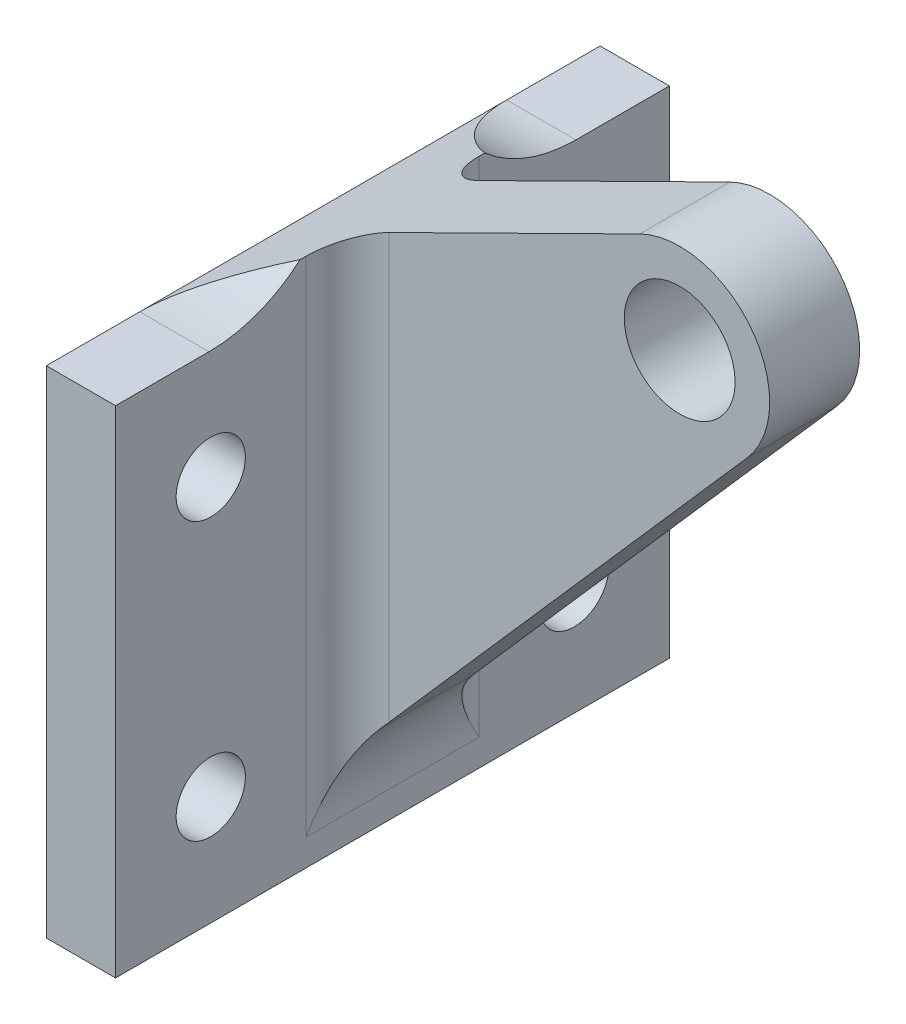
ISO-10303-21;
HEADER;
FILE_DESCRIPTION(('STEP AP214'),'2;1');
FILE_NAME('part.step','',(''),(''),'','','');
FILE_SCHEMA(('AUTOMOTIVE_DESIGN { 1 0 10303 214 1 1 1 1 }'));
ENDSEC;
DATA;
#1=APPLICATION_CONTEXT('core data for automotive mechanical design processes');
#2=APPLICATION_PROTOCOL_DEFINITION('international standard','automotive_design',2000,#1);
#3=PRODUCT_CONTEXT('',#1,'mechanical');
#4=PRODUCT('Part','Part','',(#3));
#5=PRODUCT_RELATED_PRODUCT_CATEGORY('part','',(#4));
#6=PRODUCT_DEFINITION_FORMATION('','',#4);
#7=PRODUCT_DEFINITION_CONTEXT('part definition',#1,'design');
#8=PRODUCT_DEFINITION('design','',#6,#7);
#9=PRODUCT_DEFINITION_SHAPE('','',#8);
#10=(LENGTH_UNIT() NAMED_UNIT(*) SI_UNIT(.MILLI.,.METRE.));
#11=(NAMED_UNIT(*) PLANE_ANGLE_UNIT() SI_UNIT($,.RADIAN.));
#12=(NAMED_UNIT(*) SI_UNIT($,.STERADIAN.) SOLID_ANGLE_UNIT());
#13=UNCERTAINTY_MEASURE_WITH_UNIT(LENGTH_MEASURE(1.E-05),#10,'distance_accuracy_value','');
#14=(GEOMETRIC_REPRESENTATION_CONTEXT(3) GLOBAL_UNCERTAINTY_ASSIGNED_CONTEXT((#13)) GLOBAL_UNIT_ASSIGNED_CONTEXT((#10,
#11,#12)) REPRESENTATION_CONTEXT('',''));
#15=CARTESIAN_POINT('',(0.,0.,0.));
#16=DIRECTION('',(0.,0.,1.));
#17=DIRECTION('',(1.,0.,0.));
#18=AXIS2_PLACEMENT_3D('',#15,#16,#17);
#19=CARTESIAN_POINT('',(9.56582512201105,-8.39474306965126,3.25));
#20=DIRECTION('',(-0.751616204814075,0.659600697892964,0.));
#21=DIRECTION('',(-0.659600697892964,-0.751616204814075,0.));
#22=AXIS2_PLACEMENT_3D('',#19,#20,#21);
#23=PLANE('',#22);
#24=DIRECTION('',(0.659600697892964,0.751616204814076,0.));
#25=VECTOR('',#24,1.);
#26=CARTESIAN_POINT('',(9.56582512201105,-8.39474306965126,3.25));
#27=LINE('',#26,#25);
#28=CARTESIAN_POINT('',(18.,1.21601467027,3.25));
#29=VERTEX_POINT('',#28);
#30=CARTESIAN_POINT('',(43.8855053312915,30.7125954636957,3.25));
#31=VERTEX_POINT('',#30);
#32=EDGE_CURVE('E201',#29,#31,#27,.T.);
#33=ORIENTED_EDGE('',*,*,#32,.F.);
#34=CARTESIAN_POINT('',(18.,1.21601467027,6.25));
#35=DIRECTION('',(-0.751616204814075,0.659600697892964,0.));
#36=DIRECTION('',(-0.659600697892964,-0.751616204814075,0.));
#37=AXIS2_PLACEMENT_3D('',#34,#35,#36);
#38=ELLIPSE('',#37,4.54820622474056,3.);
#39=CARTESIAN_POINT('',(17.4838379518592,0.627847069884038,3.29473744989398));
#40=VERTEX_POINT('',#39);
#41=EDGE_CURVE('E281',#29,#40,#38,.T.);
#42=ORIENTED_EDGE('',*,*,#41,.T.);
#43=DIRECTION('',(0.,0.,1.));
#44=VECTOR('',#43,1.);
#45=CARTESIAN_POINT('',(17.4838379518592,0.627847069884038,-3.25));
#46=LINE('',#45,#44);
#47=CARTESIAN_POINT('',(17.4838379518592,0.627847069884038,-3.29473744989398));
#48=VERTEX_POINT('',#47);
#49=EDGE_CURVE('E57',#40,#48,#46,.F.);
#50=ORIENTED_EDGE('',*,*,#49,.T.);
#51=CARTESIAN_POINT('',(18.,1.21601467027,-6.25));
#52=DIRECTION('',(-0.751616204814075,0.659600697892964,0.));
#53=DIRECTION('',(0.659600697892964,0.751616204814075,0.));
#54=AXIS2_PLACEMENT_3D('',#51,#52,#53);
#55=ELLIPSE('',#54,4.54820622474056,3.);
#56=CARTESIAN_POINT('',(18.,1.21601467027,-3.25));
#57=VERTEX_POINT('',#56);
#58=EDGE_CURVE('E261',#48,#57,#55,.T.);
#59=ORIENTED_EDGE('',*,*,#58,.T.);
#60=DIRECTION('',(0.659600697892964,0.751616204814076,0.));
#61=VECTOR('',#60,1.);
#62=CARTESIAN_POINT('',(9.56582512201105,-8.39474306965126,-3.25));
#63=LINE('',#62,#61);
#64=CARTESIAN_POINT('',(43.8855053312915,30.7125954636957,-3.25));
#65=VERTEX_POINT('',#64);
#66=EDGE_CURVE('E196',#57,#65,#63,.T.);
#67=ORIENTED_EDGE('',*,*,#66,.T.);
#68=DIRECTION('',(0.,0.,-1.));
#69=VECTOR('',#68,1.);
#70=CARTESIAN_POINT('',(43.8855053312915,30.7125954636957,3.25));
#71=LINE('',#70,#69);
#72=EDGE_CURVE('E203',#31,#65,#71,.T.);
#73=ORIENTED_EDGE('',*,*,#72,.F.);
#74=EDGE_LOOP('',(#33,#42,#50,#59,#67,#73));
#75=FACE_BOUND('',#74,.T.);
#76=ADVANCED_FACE('F39',(#75),#23,.F.);
#77=CARTESIAN_POINT('',(39.,35.,3.25));
#78=DIRECTION('',(0.,0.,-1.));
#79=DIRECTION('',(-1.,0.,0.));
#80=AXIS2_PLACEMENT_3D('',#77,#78,#79);
#81=CYLINDRICAL_SURFACE('',#80,6.5);
#82=CARTESIAN_POINT('',(39.,35.,-3.25));
#83=DIRECTION('',(0.,0.,1.));
#84=DIRECTION('',(1.,0.,0.));
#85=AXIS2_PLACEMENT_3D('',#82,#83,#84);
#86=CIRCLE('',#85,6.5);
#87=CARTESIAN_POINT('',(36.1168405627189,40.8255808001621,-3.25));
#88=VERTEX_POINT('',#87);
#89=EDGE_CURVE('E206',#65,#88,#86,.T.);
#90=ORIENTED_EDGE('',*,*,#89,.T.);
#91=DIRECTION('',(0.,0.,-1.));
#92=VECTOR('',#91,1.);
#93=CARTESIAN_POINT('',(36.1168405627189,40.8255808001621,3.25));
#94=LINE('',#93,#92);
#95=CARTESIAN_POINT('',(36.1168405627189,40.8255808001621,3.25));
#96=VERTEX_POINT('',#95);
#97=EDGE_CURVE('E217',#96,#88,#94,.T.);
#98=ORIENTED_EDGE('',*,*,#97,.F.);
#99=CARTESIAN_POINT('',(39.,35.,3.25));
#100=DIRECTION('',(0.,0.,1.));
#101=DIRECTION('',(1.,0.,0.));
#102=AXIS2_PLACEMENT_3D('',#99,#100,#101);
#103=CIRCLE('',#102,6.5);
#104=EDGE_CURVE('E195',#31,#96,#103,.T.);
#105=ORIENTED_EDGE('',*,*,#104,.F.);
#106=ORIENTED_EDGE('',*,*,#72,.T.);
#107=EDGE_LOOP('',(#90,#98,#105,#106));
#108=FACE_BOUND('',#107,.T.);
#109=ADVANCED_FACE('F350',(#108),#81,.T.);
#110=CARTESIAN_POINT('',(-9.12389349329391,18.4353241343397,3.25));
#111=DIRECTION('',(-0.443562990350933,0.896243200024936,0.));
#112=DIRECTION('',(-0.896243200024936,-0.443562990350933,0.));
#113=AXIS2_PLACEMENT_3D('',#110,#111,#112);
#114=PLANE('',#113);
#115=DIRECTION('',(0.896243200024937,0.443562990350933,0.));
#116=VECTOR('',#115,1.);
#117=CARTESIAN_POINT('',(-9.12389349329391,18.4353241343397,-3.25));
#118=LINE('',#117,#116);
#119=CARTESIAN_POINT('',(18.,31.8593091726763,-3.25));
#120=VERTEX_POINT('',#119);
#121=EDGE_CURVE('E209',#120,#88,#118,.T.);
#122=ORIENTED_EDGE('',*,*,#121,.F.);
#123=CARTESIAN_POINT('',(18.,31.8593091726763,-6.25));
#124=DIRECTION('',(-0.443562990350933,0.896243200024936,0.));
#125=DIRECTION('',(0.896243200024937,0.443562990350933,0.));
#126=AXIS2_PLACEMENT_3D('',#123,#124,#125);
#127=ELLIPSE('',#126,3.34730573120837,3.);
#128=CARTESIAN_POINT('',(15.,30.3745682329227,-6.25));
#129=VERTEX_POINT('',#128);
#130=EDGE_CURVE('E330',#120,#129,#127,.F.);
#131=ORIENTED_EDGE('',*,*,#130,.T.);
#132=DIRECTION('',(0.,0.,-1.));
#133=VECTOR('',#132,1.);
#134=CARTESIAN_POINT('',(15.,30.3745682329227,0.));
#135=LINE('',#134,#133);
#136=CARTESIAN_POINT('',(15.,30.3745682329227,-6.66457087813836));
#137=VERTEX_POINT('',#136);
#138=EDGE_CURVE('E240',#129,#137,#135,.T.);
#139=ORIENTED_EDGE('',*,*,#138,.T.);
#140=CARTESIAN_POINT('',(30.2055450865244,37.9,-13.25));
#141=DIRECTION('',(-0.443562990350933,0.896243200024936,0.));
#142=DIRECTION('',(-0.896243200024936,-0.443562990350933,0.));
#143=AXIS2_PLACEMENT_3D('',#140,#141,#142);
#144=ELLIPSE('',#143,22.5447122901041,10.);
#145=CARTESIAN_POINT('',(10.,27.9,-13.25));
#146=VERTEX_POINT('',#145);
#147=EDGE_CURVE('E229',#137,#146,#144,.F.);
#148=ORIENTED_EDGE('',*,*,#147,.T.);
#149=DIRECTION('',(0.,0.,-1.));
#150=VECTOR('',#149,1.);
#151=CARTESIAN_POINT('',(10.,27.9,3.25));
#152=LINE('',#151,#150);
#153=CARTESIAN_POINT('',(10.,27.9,13.25));
#154=VERTEX_POINT('',#153);
#155=EDGE_CURVE('E215',#154,#146,#152,.T.);
#156=ORIENTED_EDGE('',*,*,#155,.F.);
#157=CARTESIAN_POINT('',(30.2055450865244,37.9,13.25));
#158=DIRECTION('',(-0.443562990350933,0.896243200024936,0.));
#159=DIRECTION('',(0.896243200024936,0.443562990350933,0.));
#160=AXIS2_PLACEMENT_3D('',#157,#158,#159);
#161=ELLIPSE('',#160,22.5447122901041,10.);
#162=CARTESIAN_POINT('',(15.,30.3745682329227,6.66457087813836));
#163=VERTEX_POINT('',#162);
#164=EDGE_CURVE('E235',#154,#163,#161,.F.);
#165=ORIENTED_EDGE('',*,*,#164,.T.);
#166=DIRECTION('',(0.,0.,-1.));
#167=VECTOR('',#166,1.);
#168=CARTESIAN_POINT('',(15.,30.3745682329227,0.));
#169=LINE('',#168,#167);
#170=CARTESIAN_POINT('',(15.,30.3745682329227,6.25));
#171=VERTEX_POINT('',#170);
#172=EDGE_CURVE('E242',#171,#163,#169,.F.);
#173=ORIENTED_EDGE('',*,*,#172,.F.);
#174=CARTESIAN_POINT('',(18.,31.8593091726763,6.25));
#175=DIRECTION('',(-0.443562990350933,0.896243200024936,0.));
#176=DIRECTION('',(-0.896243200024937,-0.443562990350933,0.));
#177=AXIS2_PLACEMENT_3D('',#174,#175,#176);
#178=ELLIPSE('',#177,3.34730573120837,3.);
#179=CARTESIAN_POINT('',(18.,31.8593091726763,3.25));
#180=VERTEX_POINT('',#179);
#181=EDGE_CURVE('E11',#171,#180,#178,.F.);
#182=ORIENTED_EDGE('',*,*,#181,.T.);
#183=DIRECTION('',(0.896243200024937,0.443562990350933,0.));
#184=VECTOR('',#183,1.);
#185=CARTESIAN_POINT('',(-9.12389349329391,18.4353241343397,3.25));
#186=LINE('',#185,#184);
#187=EDGE_CURVE('E199',#180,#96,#186,.T.);
#188=ORIENTED_EDGE('',*,*,#187,.T.);
#189=ORIENTED_EDGE('',*,*,#97,.T.);
#190=EDGE_LOOP('',(#122,#131,#139,#148,#156,#165,#173,#182,#188,#189));
#191=FACE_BOUND('',#190,.T.);
#192=ADVANCED_FACE('F313',(#191),#114,.T.);
#193=CARTESIAN_POINT('',(10.,0.,3.25));
#194=DIRECTION('',(1.,0.,0.));
#195=DIRECTION('',(0.,0.,-1.));
#196=AXIS2_PLACEMENT_3D('',#193,#194,#195);
#197=PLANE('',#196);
#198=CARTESIAN_POINT('',(10.,0.,-13.125));
#199=DIRECTION('',(1.,0.,0.));
#200=DIRECTION('',(0.,0.,-1.));
#201=AXIS2_PLACEMENT_3D('',#198,#199,#200);
#202=CIRCLE('',#201,2.5);
#203=CARTESIAN_POINT('',(10.,0.,-15.625));
#204=VERTEX_POINT('',#203);
#205=EDGE_CURVE('E290',#204,#204,#202,.T.);
#206=ORIENTED_EDGE('',*,*,#205,.T.);
#207=EDGE_LOOP('',(#206));
#208=FACE_BOUND('',#207,.T.);
#209=CARTESIAN_POINT('',(10.,20.,-13.125));
#210=DIRECTION('',(1.,0.,0.));
#211=DIRECTION('',(0.,0.,-1.));
#212=AXIS2_PLACEMENT_3D('',#209,#210,#211);
#213=CIRCLE('',#212,2.5);
#214=CARTESIAN_POINT('',(10.,20.,-15.625));
#215=VERTEX_POINT('',#214);
#216=EDGE_CURVE('E295',#215,#215,#213,.T.);
#217=ORIENTED_EDGE('',*,*,#216,.T.);
#218=EDGE_LOOP('',(#217));
#219=FACE_BOUND('',#218,.T.);
#220=CARTESIAN_POINT('',(10.,0.,13.125));
#221=DIRECTION('',(-1.,0.,0.));
#222=DIRECTION('',(0.,0.,1.));
#223=AXIS2_PLACEMENT_3D('',#220,#221,#222);
#224=CIRCLE('',#223,2.5);
#225=CARTESIAN_POINT('',(10.,0.,15.625));
#226=VERTEX_POINT('',#225);
#227=EDGE_CURVE('E286',#226,#226,#224,.T.);
#228=ORIENTED_EDGE('',*,*,#227,.F.);
#229=EDGE_LOOP('',(#228));
#230=FACE_BOUND('',#229,.T.);
#231=CARTESIAN_POINT('',(10.,20.,13.125));
#232=DIRECTION('',(-1.,0.,0.));
#233=DIRECTION('',(0.,0.,1.));
#234=AXIS2_PLACEMENT_3D('',#231,#232,#233);
#235=CIRCLE('',#234,2.5);
#236=CARTESIAN_POINT('',(10.,20.,15.625));
#237=VERTEX_POINT('',#236);
#238=EDGE_CURVE('E174',#237,#237,#235,.T.);
#239=ORIENTED_EDGE('',*,*,#238,.F.);
#240=EDGE_LOOP('',(#239));
#241=FACE_BOUND('',#240,.T.);
#242=ORIENTED_EDGE('',*,*,#155,.T.);
#243=DIRECTION('',(0.,0.,-1.));
#244=VECTOR('',#243,1.);
#245=CARTESIAN_POINT('',(10.,27.9,-20.));
#246=LINE('',#245,#244);
#247=CARTESIAN_POINT('',(10.,27.9,-20.));
#248=VERTEX_POINT('',#247);
#249=EDGE_CURVE('E171',#146,#248,#246,.T.);
#250=ORIENTED_EDGE('',*,*,#249,.T.);
#251=DIRECTION('',(0.,-1.,0.));
#252=VECTOR('',#251,1.);
#253=CARTESIAN_POINT('',(10.,27.9,-20.));
#254=LINE('',#253,#252);
#255=CARTESIAN_POINT('',(10.,-7.90000000000001,-20.));
#256=VERTEX_POINT('',#255);
#257=EDGE_CURVE('E181',#248,#256,#254,.T.);
#258=ORIENTED_EDGE('',*,*,#257,.T.);
#259=DIRECTION('',(0.,0.,-1.));
#260=VECTOR('',#259,1.);
#261=CARTESIAN_POINT('',(10.,-7.9,3.25));
#262=LINE('',#261,#260);
#263=CARTESIAN_POINT('',(10.,-7.90000000000001,20.));
#264=VERTEX_POINT('',#263);
#265=EDGE_CURVE('E145',#264,#256,#262,.T.);
#266=ORIENTED_EDGE('',*,*,#265,.F.);
#267=DIRECTION('',(0.,1.,0.));
#268=VECTOR('',#267,1.);
#269=CARTESIAN_POINT('',(10.,27.9,20.));
#270=LINE('',#269,#268);
#271=CARTESIAN_POINT('',(10.,27.9,20.));
#272=VERTEX_POINT('',#271);
#273=EDGE_CURVE('E183',#264,#272,#270,.T.);
#274=ORIENTED_EDGE('',*,*,#273,.T.);
#275=EDGE_CURVE('E168',#272,#154,#246,.T.);
#276=ORIENTED_EDGE('',*,*,#275,.T.);
#277=EDGE_LOOP('',(#242,#250,#258,#266,#274,#276));
#278=FACE_BOUND('',#277,.T.);
#279=ADVANCED_FACE('F310',(#208,#219,#230,#241,#278),#197,.F.);
#280=CARTESIAN_POINT('',(39.,35.,3.25));
#281=DIRECTION('',(0.,0.,-1.));
#282=DIRECTION('',(-1.,0.,0.));
#283=AXIS2_PLACEMENT_3D('',#280,#281,#282);
#284=CYLINDRICAL_SURFACE('',#283,4.);
#285=CARTESIAN_POINT('',(39.,35.,3.25));
#286=DIRECTION('',(0.,0.,1.));
#287=DIRECTION('',(1.,0.,0.));
#288=AXIS2_PLACEMENT_3D('',#285,#286,#287);
#289=CIRCLE('',#288,4.);
#290=CARTESIAN_POINT('',(35.,35.,3.25));
#291=VERTEX_POINT('',#290);
#292=EDGE_CURVE('E192',#291,#291,#289,.T.);
#293=CARTESIAN_POINT('',(39.,35.,-3.25));
#294=DIRECTION('',(0.,0.,1.));
#295=DIRECTION('',(1.,0.,0.));
#296=AXIS2_PLACEMENT_3D('',#293,#294,#295);
#297=CIRCLE('',#296,4.);
#298=CARTESIAN_POINT('',(35.,35.,-3.25));
#299=VERTEX_POINT('',#298);
#300=EDGE_CURVE('E188',#299,#299,#297,.T.);
#301=CARTESIAN_POINT('',(35.,35.,3.25));
#302=CARTESIAN_POINT('',(35.,35.,3.18229166666667));
#303=CARTESIAN_POINT('',(35.,35.,3.11458333333333));
#304=CARTESIAN_POINT('',(35.,35.,2.97916666666667));
#305=CARTESIAN_POINT('',(35.,35.,2.91145833333333));
#306=CARTESIAN_POINT('',(35.,35.,2.77604166666667));
#307=CARTESIAN_POINT('',(35.,35.,2.70833333333333));
#308=CARTESIAN_POINT('',(35.,35.,2.57291666666667));
#309=CARTESIAN_POINT('',(35.,35.,2.50520833333333));
#310=CARTESIAN_POINT('',(35.,35.,2.36979166666667));
#311=CARTESIAN_POINT('',(35.,35.,2.30208333333333));
#312=CARTESIAN_POINT('',(35.,35.,2.16666666666667));
#313=CARTESIAN_POINT('',(35.,35.,2.09895833333333));
#314=CARTESIAN_POINT('',(35.,35.,1.96354166666667));
#315=CARTESIAN_POINT('',(35.,35.,1.89583333333333));
#316=CARTESIAN_POINT('',(35.,35.,1.76041666666667));
#317=CARTESIAN_POINT('',(35.,35.,1.69270833333333));
#318=CARTESIAN_POINT('',(35.,35.,1.55729166666667));
#319=CARTESIAN_POINT('',(35.,35.,1.48958333333333));
#320=CARTESIAN_POINT('',(35.,35.,1.35416666666667));
#321=CARTESIAN_POINT('',(35.,35.,1.28645833333333));
#322=CARTESIAN_POINT('',(35.,35.,1.15104166666667));
#323=CARTESIAN_POINT('',(35.,35.,1.08333333333333));
#324=CARTESIAN_POINT('',(35.,35.,0.947916666666666));
#325=CARTESIAN_POINT('',(35.,35.,0.880208333333333));
#326=CARTESIAN_POINT('',(35.,35.,0.744791666666666));
#327=CARTESIAN_POINT('',(35.,35.,0.677083333333333));
#328=CARTESIAN_POINT('',(35.,35.,0.541666666666666));
#329=CARTESIAN_POINT('',(35.,35.,0.473958333333333));
#330=CARTESIAN_POINT('',(35.,35.,0.338541666666666));
#331=CARTESIAN_POINT('',(35.,35.,0.270833333333333));
#332=CARTESIAN_POINT('',(35.,35.,0.135416666666666));
#333=CARTESIAN_POINT('',(35.,35.,0.0677083333333329));
#334=CARTESIAN_POINT('',(35.,35.,-0.0677083333333338));
#335=CARTESIAN_POINT('',(35.,35.,-0.135416666666667));
#336=CARTESIAN_POINT('',(35.,35.,-0.270833333333334));
#337=CARTESIAN_POINT('',(35.,35.,-0.338541666666667));
#338=CARTESIAN_POINT('',(35.,35.,-0.473958333333334));
#339=CARTESIAN_POINT('',(35.,35.,-0.541666666666667));
#340=CARTESIAN_POINT('',(35.,35.,-0.677083333333333));
#341=CARTESIAN_POINT('',(35.,35.,-0.744791666666667));
#342=CARTESIAN_POINT('',(35.,35.,-0.880208333333333));
#343=CARTESIAN_POINT('',(35.,35.,-0.947916666666666));
#344=CARTESIAN_POINT('',(35.,35.,-1.08333333333333));
#345=CARTESIAN_POINT('',(35.,35.,-1.15104166666667));
#346=CARTESIAN_POINT('',(35.,35.,-1.28645833333333));
#347=CARTESIAN_POINT('',(35.,35.,-1.35416666666667));
#348=CARTESIAN_POINT('',(35.,35.,-1.48958333333333));
#349=CARTESIAN_POINT('',(35.,35.,-1.55729166666667));
#350=CARTESIAN_POINT('',(35.,35.,-1.69270833333333));
#351=CARTESIAN_POINT('',(35.,35.,-1.76041666666667));
#352=CARTESIAN_POINT('',(35.,35.,-1.89583333333333));
#353=CARTESIAN_POINT('',(35.,35.,-1.96354166666667));
#354=CARTESIAN_POINT('',(35.,35.,-2.09895833333333));
#355=CARTESIAN_POINT('',(35.,35.,-2.16666666666667));
#356=CARTESIAN_POINT('',(35.,35.,-2.30208333333333));
#357=CARTESIAN_POINT('',(35.,35.,-2.36979166666667));
#358=CARTESIAN_POINT('',(35.,35.,-2.50520833333333));
#359=CARTESIAN_POINT('',(35.,35.,-2.57291666666667));
#360=CARTESIAN_POINT('',(35.,35.,-2.70833333333333));
#361=CARTESIAN_POINT('',(35.,35.,-2.77604166666667));
#362=CARTESIAN_POINT('',(35.,35.,-2.91145833333333));
#363=CARTESIAN_POINT('',(35.,35.,-2.97916666666667));
#364=CARTESIAN_POINT('',(35.,35.,-3.11458333333333));
#365=CARTESIAN_POINT('',(35.,35.,-3.18229166666667));
#366=CARTESIAN_POINT('',(35.,35.,-3.25));
#367=B_SPLINE_CURVE_WITH_KNOTS('',3,(#301,#302,#303,#304,#305,#306,#307,#308,#309,#310,#311,
#312,#313,#314,#315,#316,#317,#318,#319,#320,#321,#322,#323,#324,#325,#326,#327,#328,#329,#330,
#331,#332,#333,#334,#335,#336,#337,#338,#339,#340,#341,#342,#343,#344,#345,#346,#347,#348,#349,
#350,#351,#352,#353,#354,#355,#356,#357,#358,#359,#360,#361,#362,#363,#364,#365,#366),
.UNSPECIFIED.,.F.,.F.,(4,2,2,2,2,2,2,2,2,2,2,2,2,2,2,2,2,2,2,2,2,2,2,2,2,2,2,2,2,2,2,2,4),(0.,
0.203125,0.40625,0.609375,0.8125,1.015625,1.21875,1.421875,1.625,1.828125,2.03125,2.234375,
2.4375,2.640625,2.84375,3.046875,3.25,3.453125,3.65625,3.859375,4.0625,4.265625,4.46875,
4.671875,4.875,5.078125,5.28125,5.484375,5.6875,5.890625,6.09375,6.296875,6.5),.UNSPECIFIED.);
#368=EDGE_CURVE('BSEAM272',#291,#299,#367,.T.);
#369=ORIENTED_EDGE('',*,*,#292,.T.);
#370=ORIENTED_EDGE('',*,*,#300,.F.);
#371=ORIENTED_EDGE('',*,*,#368,.T.);
#372=ORIENTED_EDGE('',*,*,#368,.F.);
#373=EDGE_LOOP('',(#369,#371,#370,#372));
#374=FACE_BOUND('',#373,.T.);
#375=ADVANCED_FACE('F272',(#374),#284,.F.);
#376=CARTESIAN_POINT('',(0.,0.,3.25));
#377=DIRECTION('',(0.,0.,1.));
#378=DIRECTION('',(1.,0.,0.));
#379=AXIS2_PLACEMENT_3D('',#376,#377,#378);
#380=PLANE('',#379);
#381=ORIENTED_EDGE('',*,*,#187,.F.);
#382=DIRECTION('',(0.,-1.,0.));
#383=VECTOR('',#382,1.);
#384=CARTESIAN_POINT('',(18.,0.,3.25));
#385=LINE('',#384,#383);
#386=EDGE_CURVE('E251',#180,#29,#385,.T.);
#387=ORIENTED_EDGE('',*,*,#386,.T.);
#388=ORIENTED_EDGE('',*,*,#32,.T.);
#389=ORIENTED_EDGE('',*,*,#104,.T.);
#390=EDGE_LOOP('',(#381,#387,#388,#389));
#391=FACE_BOUND('',#390,.T.);
#392=ORIENTED_EDGE('',*,*,#292,.F.);
#393=EDGE_LOOP('',(#392));
#394=FACE_BOUND('',#393,.T.);
#395=ADVANCED_FACE('F342',(#391,#394),#380,.T.);
#396=CARTESIAN_POINT('',(0.,0.,-3.25));
#397=DIRECTION('',(0.,0.,1.));
#398=DIRECTION('',(1.,0.,0.));
#399=AXIS2_PLACEMENT_3D('',#396,#397,#398);
#400=PLANE('',#399);
#401=ORIENTED_EDGE('',*,*,#300,.T.);
#402=EDGE_LOOP('',(#401));
#403=FACE_BOUND('',#402,.T.);
#404=ORIENTED_EDGE('',*,*,#66,.F.);
#405=DIRECTION('',(0.,-1.,0.));
#406=VECTOR('',#405,1.);
#407=CARTESIAN_POINT('',(18.,30.3745682329227,-3.25));
#408=LINE('',#407,#406);
#409=EDGE_CURVE('E249',#57,#120,#408,.F.);
#410=ORIENTED_EDGE('',*,*,#409,.T.);
#411=ORIENTED_EDGE('',*,*,#121,.T.);
#412=ORIENTED_EDGE('',*,*,#89,.F.);
#413=EDGE_LOOP('',(#404,#410,#411,#412));
#414=FACE_BOUND('',#413,.T.);
#415=ADVANCED_FACE('F352',(#403,#414),#400,.F.);
#416=CARTESIAN_POINT('',(15.,27.9,-20.));
#417=DIRECTION('',(0.,1.,0.));
#418=DIRECTION('',(0.,0.,1.));
#419=AXIS2_PLACEMENT_3D('',#416,#417,#418);
#420=PLANE('',#419);
#421=ORIENTED_EDGE('',*,*,#249,.F.);
#422=DIRECTION('',(-1.,0.,0.));
#423=VECTOR('',#422,1.);
#424=CARTESIAN_POINT('',(15.,27.9,-13.25));
#425=LINE('',#424,#423);
#426=CARTESIAN_POINT('',(15.,27.9,-13.25));
#427=VERTEX_POINT('',#426);
#428=EDGE_CURVE('E223',#146,#427,#425,.F.);
#429=ORIENTED_EDGE('',*,*,#428,.T.);
#430=DIRECTION('',(0.,0.,-1.));
#431=VECTOR('',#430,1.);
#432=CARTESIAN_POINT('',(15.,27.9,-20.));
#433=LINE('',#432,#431);
#434=CARTESIAN_POINT('',(15.,27.9,-20.));
#435=VERTEX_POINT('',#434);
#436=EDGE_CURVE('E178',#427,#435,#433,.T.);
#437=ORIENTED_EDGE('',*,*,#436,.T.);
#438=DIRECTION('',(-1.,0.,0.));
#439=VECTOR('',#438,1.);
#440=CARTESIAN_POINT('',(15.,27.9,-20.));
#441=LINE('',#440,#439);
#442=EDGE_CURVE('E167',#435,#248,#441,.T.);
#443=ORIENTED_EDGE('',*,*,#442,.T.);
#444=EDGE_LOOP('',(#421,#429,#437,#443));
#445=FACE_BOUND('',#444,.T.);
#446=ADVANCED_FACE('F320',(#445),#420,.T.);
#447=CARTESIAN_POINT('',(15.,27.9,-20.));
#448=DIRECTION('',(0.,0.,-1.));
#449=DIRECTION('',(0.,1.,0.));
#450=AXIS2_PLACEMENT_3D('',#447,#448,#449);
#451=PLANE('',#450);
#452=ORIENTED_EDGE('',*,*,#257,.F.);
#453=ORIENTED_EDGE('',*,*,#442,.F.);
#454=DIRECTION('',(0.,-1.,0.));
#455=VECTOR('',#454,1.);
#456=CARTESIAN_POINT('',(15.,27.9,-20.));
#457=LINE('',#456,#455);
#458=CARTESIAN_POINT('',(15.,-7.90000000000001,-20.));
#459=VERTEX_POINT('',#458);
#460=EDGE_CURVE('E159',#435,#459,#457,.T.);
#461=ORIENTED_EDGE('',*,*,#460,.T.);
#462=DIRECTION('',(-1.,0.,0.));
#463=VECTOR('',#462,1.);
#464=CARTESIAN_POINT('',(15.,-7.90000000000001,-20.));
#465=LINE('',#464,#463);
#466=EDGE_CURVE('E140',#459,#256,#465,.T.);
#467=ORIENTED_EDGE('',*,*,#466,.T.);
#468=EDGE_LOOP('',(#452,#453,#461,#467));
#469=FACE_BOUND('',#468,.T.);
#470=ADVANCED_FACE('F165',(#469),#451,.T.);
#471=CARTESIAN_POINT('',(15.,27.9,20.));
#472=VERTEX_POINT('',#471);
#473=CARTESIAN_POINT('',(15.,27.9,13.25));
#474=VERTEX_POINT('',#473);
#475=EDGE_CURVE('E151',#472,#474,#433,.T.);
#476=ORIENTED_EDGE('',*,*,#475,.T.);
#477=DIRECTION('',(-1.,0.,0.));
#478=VECTOR('',#477,1.);
#479=CARTESIAN_POINT('',(10.,27.9,13.25));
#480=LINE('',#479,#478);
#481=EDGE_CURVE('E226',#474,#154,#480,.T.);
#482=ORIENTED_EDGE('',*,*,#481,.T.);
#483=ORIENTED_EDGE('',*,*,#275,.F.);
#484=DIRECTION('',(-1.,0.,0.));
#485=VECTOR('',#484,1.);
#486=CARTESIAN_POINT('',(15.,27.9,20.));
#487=LINE('',#486,#485);
#488=EDGE_CURVE('E189',#472,#272,#487,.T.);
#489=ORIENTED_EDGE('',*,*,#488,.F.);
#490=EDGE_LOOP('',(#476,#482,#483,#489));
#491=FACE_BOUND('',#490,.T.);
#492=ADVANCED_FACE('F361',(#491),#420,.T.);
#493=CARTESIAN_POINT('',(15.,27.9,20.));
#494=DIRECTION('',(0.,0.,1.));
#495=DIRECTION('',(0.,-1.,0.));
#496=AXIS2_PLACEMENT_3D('',#493,#494,#495);
#497=PLANE('',#496);
#498=ORIENTED_EDGE('',*,*,#273,.F.);
#499=DIRECTION('',(-1.,0.,0.));
#500=VECTOR('',#499,1.);
#501=CARTESIAN_POINT('',(15.,-7.90000000000001,20.));
#502=LINE('',#501,#500);
#503=CARTESIAN_POINT('',(15.,-7.90000000000001,20.));
#504=VERTEX_POINT('',#503);
#505=EDGE_CURVE('E150',#504,#264,#502,.T.);
#506=ORIENTED_EDGE('',*,*,#505,.F.);
#507=DIRECTION('',(0.,1.,0.));
#508=VECTOR('',#507,1.);
#509=CARTESIAN_POINT('',(15.,27.9,20.));
#510=LINE('',#509,#508);
#511=EDGE_CURVE('E162',#504,#472,#510,.T.);
#512=ORIENTED_EDGE('',*,*,#511,.T.);
#513=ORIENTED_EDGE('',*,*,#488,.T.);
#514=EDGE_LOOP('',(#498,#506,#512,#513));
#515=FACE_BOUND('',#514,.T.);
#516=ADVANCED_FACE('F501',(#515),#497,.T.);
#517=CARTESIAN_POINT('',(15.,-7.90000000000001,-20.));
#518=DIRECTION('',(0.,-1.,0.));
#519=DIRECTION('',(0.,0.,-1.));
#520=AXIS2_PLACEMENT_3D('',#517,#518,#519);
#521=PLANE('',#520);
#522=ORIENTED_EDGE('',*,*,#265,.T.);
#523=ORIENTED_EDGE('',*,*,#466,.F.);
#524=DIRECTION('',(0.,0.,1.));
#525=VECTOR('',#524,1.);
#526=CARTESIAN_POINT('',(15.,-7.90000000000001,-20.));
#527=LINE('',#526,#525);
#528=EDGE_CURVE('E144',#459,#504,#527,.T.);
#529=ORIENTED_EDGE('',*,*,#528,.T.);
#530=ORIENTED_EDGE('',*,*,#505,.T.);
#531=EDGE_LOOP('',(#522,#523,#529,#530));
#532=FACE_BOUND('',#531,.T.);
#533=ADVANCED_FACE('F142',(#532),#521,.T.);
#534=CARTESIAN_POINT('',(15.,0.,0.));
#535=DIRECTION('',(-1.,0.,0.));
#536=DIRECTION('',(0.,0.,1.));
#537=AXIS2_PLACEMENT_3D('',#534,#535,#536);
#538=PLANE('',#537);
#539=CARTESIAN_POINT('',(15.,0.,-13.125));
#540=DIRECTION('',(-1.,0.,0.));
#541=DIRECTION('',(0.,0.,1.));
#542=AXIS2_PLACEMENT_3D('',#539,#540,#541);
#543=CIRCLE('',#542,2.5);
#544=CARTESIAN_POINT('',(15.,0.,-10.625));
#545=VERTEX_POINT('',#544);
#546=EDGE_CURVE('E44',#545,#545,#543,.F.);
#547=ORIENTED_EDGE('',*,*,#546,.F.);
#548=EDGE_LOOP('',(#547));
#549=FACE_BOUND('',#548,.T.);
#550=CARTESIAN_POINT('',(15.,20.,-13.125));
#551=DIRECTION('',(-1.,0.,0.));
#552=DIRECTION('',(0.,0.,1.));
#553=AXIS2_PLACEMENT_3D('',#550,#551,#552);
#554=CIRCLE('',#553,2.5);
#555=CARTESIAN_POINT('',(15.,20.,-10.625));
#556=VERTEX_POINT('',#555);
#557=EDGE_CURVE('E288',#556,#556,#554,.F.);
#558=ORIENTED_EDGE('',*,*,#557,.F.);
#559=EDGE_LOOP('',(#558));
#560=FACE_BOUND('',#559,.T.);
#561=CARTESIAN_POINT('',(15.,0.,13.125));
#562=DIRECTION('',(-1.,0.,0.));
#563=DIRECTION('',(0.,0.,1.));
#564=AXIS2_PLACEMENT_3D('',#561,#562,#563);
#565=CIRCLE('',#564,2.5);
#566=CARTESIAN_POINT('',(15.,0.,15.625));
#567=VERTEX_POINT('',#566);
#568=EDGE_CURVE('E184',#567,#567,#565,.T.);
#569=ORIENTED_EDGE('',*,*,#568,.T.);
#570=EDGE_LOOP('',(#569));
#571=FACE_BOUND('',#570,.T.);
#572=CARTESIAN_POINT('',(15.,20.,13.125));
#573=DIRECTION('',(-1.,0.,0.));
#574=DIRECTION('',(0.,0.,1.));
#575=AXIS2_PLACEMENT_3D('',#572,#573,#574);
#576=CIRCLE('',#575,2.5);
#577=CARTESIAN_POINT('',(15.,20.,15.625));
#578=VERTEX_POINT('',#577);
#579=EDGE_CURVE('E283',#578,#578,#576,.T.);
#580=ORIENTED_EDGE('',*,*,#579,.T.);
#581=EDGE_LOOP('',(#580));
#582=FACE_BOUND('',#581,.T.);
#583=ORIENTED_EDGE('',*,*,#138,.F.);
#584=DIRECTION('',(0.,-1.,0.));
#585=VECTOR('',#584,1.);
#586=CARTESIAN_POINT('',(15.,-5.96815990904561,-6.25));
#587=LINE('',#586,#585);
#588=CARTESIAN_POINT('',(15.,-5.96815990904561,-6.25));
#589=VERTEX_POINT('',#588);
#590=EDGE_CURVE('E246',#129,#589,#587,.T.);
#591=ORIENTED_EDGE('',*,*,#590,.T.);
#592=DIRECTION('',(0.,0.,1.));
#593=VECTOR('',#592,1.);
#594=CARTESIAN_POINT('',(15.,-5.96815990904561,3.25));
#595=LINE('',#594,#593);
#596=CARTESIAN_POINT('',(15.,-5.96815990904561,6.25));
#597=VERTEX_POINT('',#596);
#598=EDGE_CURVE('E220',#589,#597,#595,.T.);
#599=ORIENTED_EDGE('',*,*,#598,.T.);
#600=DIRECTION('',(0.,-1.,0.));
#601=VECTOR('',#600,1.);
#602=CARTESIAN_POINT('',(15.,0.,6.25));
#603=LINE('',#602,#601);
#604=EDGE_CURVE('E244',#597,#171,#603,.F.);
#605=ORIENTED_EDGE('',*,*,#604,.T.);
#606=ORIENTED_EDGE('',*,*,#172,.T.);
#607=CARTESIAN_POINT('',(15.,37.9,13.25));
#608=DIRECTION('',(-1.,0.,0.));
#609=DIRECTION('',(0.,0.,1.));
#610=AXIS2_PLACEMENT_3D('',#607,#608,#609);
#611=CIRCLE('',#610,10.);
#612=EDGE_CURVE('E238',#163,#474,#611,.T.);
#613=ORIENTED_EDGE('',*,*,#612,.T.);
#614=ORIENTED_EDGE('',*,*,#475,.F.);
#615=ORIENTED_EDGE('',*,*,#511,.F.);
#616=ORIENTED_EDGE('',*,*,#528,.F.);
#617=ORIENTED_EDGE('',*,*,#460,.F.);
#618=ORIENTED_EDGE('',*,*,#436,.F.);
#619=CARTESIAN_POINT('',(15.,37.9,-13.25));
#620=DIRECTION('',(-1.,0.,0.));
#621=DIRECTION('',(0.,0.,1.));
#622=AXIS2_PLACEMENT_3D('',#619,#620,#621);
#623=CIRCLE('',#622,10.);
#624=EDGE_CURVE('E232',#427,#137,#623,.T.);
#625=ORIENTED_EDGE('',*,*,#624,.T.);
#626=EDGE_LOOP('',(#583,#591,#599,#605,#606,#613,#614,#615,#616,#617,#618,#625));
#627=FACE_BOUND('',#626,.T.);
#628=ADVANCED_FACE('F157',(#549,#560,#571,#582,#627),#538,.F.);
#629=CARTESIAN_POINT('',(25.,-5.96815990904561,0.));
#630=DIRECTION('',(0.,0.,-1.));
#631=DIRECTION('',(-1.,0.,0.));
#632=AXIS2_PLACEMENT_3D('',#629,#630,#631);
#633=CYLINDRICAL_SURFACE('',#632,10.);
#634=ORIENTED_EDGE('',*,*,#598,.F.);
#635=CARTESIAN_POINT('',(17.4838379518592,0.627847069884038,-3.29473744989398));
#636=CARTESIAN_POINT('',(17.4202308618508,0.555368178633478,-3.30585081671308));
#637=CARTESIAN_POINT('',(17.3578332333349,0.482149526497772,-3.3188610022736));
#638=CARTESIAN_POINT('',(17.235521447333,0.334384453956802,-3.34835673335101));
#639=CARTESIAN_POINT('',(17.1756065783561,0.259838422820542,-3.36484127485462));
#640=CARTESIAN_POINT('',(16.9998574632528,0.0346662334472458,-3.41897027822834));
#641=CARTESIAN_POINT('',(16.8877705420143,-0.117777436905148,-3.46133589226868));
#642=CARTESIAN_POINT('',(16.6745356141304,-0.425464557425899,-3.55617842493446));
#643=CARTESIAN_POINT('',(16.5733212864149,-0.580683391574653,-3.60858788208233));
#644=CARTESIAN_POINT('',(16.3808722703066,-0.894255890508082,-3.72197664372413));
#645=CARTESIAN_POINT('',(16.2896439142133,-1.05261147007053,-3.78296133058925));
#646=CARTESIAN_POINT('',(16.0734951959992,-1.45240252022874,-3.94459541240703));
#647=CARTESIAN_POINT('',(15.9548189674203,-1.69541779662587,-4.04972545927003));
#648=CARTESIAN_POINT('',(15.7391462051973,-2.18552562236807,-4.271989716993));
#649=CARTESIAN_POINT('',(15.6421571255953,-2.43261954233615,-4.38912803507578));
#650=CARTESIAN_POINT('',(15.4688600234865,-2.93054824882982,-4.63267603909448));
#651=CARTESIAN_POINT('',(15.3926215250681,-3.1813927111456,-4.75911513273466));
#652=CARTESIAN_POINT('',(15.2606390880054,-3.68504790701747,-5.0183166067667));
#653=CARTESIAN_POINT('',(15.2048887454452,-3.93785800091002,-5.15107699665117));
#654=CARTESIAN_POINT('',(15.106338212227,-4.4836674245282,-5.44147988497876));
#655=CARTESIAN_POINT('',(15.066830713776,-4.77688991510082,-5.59981827010437));
#656=CARTESIAN_POINT('',(15.0139527990395,-5.36365291010701,-5.91891911197574));
#657=CARTESIAN_POINT('',(15.0005299472532,-5.6571915872502,-6.07967604961444));
#658=CARTESIAN_POINT('',(15.0000051309838,-5.9564658454704,-6.24359489813149));
#659=CARTESIAN_POINT('',(15.0000000029867,-5.96231290163126,-6.2467974627104));
#660=CARTESIAN_POINT('',(15.,-5.96815990904561,-6.25));
#661=B_SPLINE_CURVE_WITH_KNOTS('',3,(#635,#636,#637,#638,#639,#640,#641,#642,#643,#644,#645,
#646,#647,#648,#649,#650,#651,#652,#653,#654,#655,#656,#657,#658,#659,#660),.UNSPECIFIED.,.F.,
.F.,(4,2,2,2,2,2,2,2,2,2,2,2,4),(0.,0.291141966507585,0.582199914394283,1.16318147399905,
1.74038948427481,2.31796141855304,3.1871388357775,4.05661453841766,4.92896849789704,
5.80104955617064,6.80674083768524,7.81040837320717,7.83040837912435),.UNSPECIFIED.);
#662=EDGE_CURVE('E254',#589,#48,#661,.F.);
#663=ORIENTED_EDGE('',*,*,#662,.T.);
#664=ORIENTED_EDGE('',*,*,#49,.F.);
#665=CARTESIAN_POINT('',(17.4838379518592,0.627847069884038,3.29473744989398));
#666=CARTESIAN_POINT('',(17.4202308618508,0.555368178633472,3.30585081671308));
#667=CARTESIAN_POINT('',(17.3578332333349,0.482149526497761,3.3188610022736));
#668=CARTESIAN_POINT('',(17.235521447333,0.334384453956779,3.34835673335101));
#669=CARTESIAN_POINT('',(17.1756065783561,0.259838422820513,3.36484127485463));
#670=CARTESIAN_POINT('',(16.9998574632528,0.0346662334471985,3.41897027822836));
#671=CARTESIAN_POINT('',(16.8877705420142,-0.117777436905209,3.46133589226869));
#672=CARTESIAN_POINT('',(16.6745356141304,-0.425464557425961,3.55617842493448));
#673=CARTESIAN_POINT('',(16.5733212864149,-0.580683391574702,3.60858788208235));
#674=CARTESIAN_POINT('',(16.3808722703066,-0.894255890508107,3.72197664372414));
#675=CARTESIAN_POINT('',(16.2896439142133,-1.05261147007055,3.78296133058926));
#676=CARTESIAN_POINT('',(16.0734951959992,-1.45240252022873,3.94459541240703));
#677=CARTESIAN_POINT('',(15.9548189674203,-1.69541779662585,4.04972545927003));
#678=CARTESIAN_POINT('',(15.7391462051973,-2.18552562236804,4.27198971699299));
#679=CARTESIAN_POINT('',(15.6421571255953,-2.43261954233612,4.38912803507575));
#680=CARTESIAN_POINT('',(15.4688600234865,-2.93054824882978,4.63267603909447));
#681=CARTESIAN_POINT('',(15.3926215250681,-3.18139271114557,4.75911513273467));
#682=CARTESIAN_POINT('',(15.2606390880054,-3.68504790701747,5.01831660676667));
#683=CARTESIAN_POINT('',(15.2048887454452,-3.93785800091006,5.15107699665108));
#684=CARTESIAN_POINT('',(15.106338212227,-4.48366742452814,5.44147988497886));
#685=CARTESIAN_POINT('',(15.066830713776,-4.7768899151006,5.59981827010479));
#686=CARTESIAN_POINT('',(15.0139527990395,-5.36365291010724,5.91891911197533));
#687=CARTESIAN_POINT('',(15.0005299472532,-5.65719158725105,6.07967604961288));
#688=CARTESIAN_POINT('',(15.0000051309838,-5.95646584547044,6.24359489813143));
#689=CARTESIAN_POINT('',(15.0000000029867,-5.96231290163128,6.24679746271037));
#690=CARTESIAN_POINT('',(15.,-5.96815990904561,6.25));
#691=B_SPLINE_CURVE_WITH_KNOTS('',3,(#665,#666,#667,#668,#669,#670,#671,#672,#673,#674,#675,
#676,#677,#678,#679,#680,#681,#682,#683,#684,#685,#686,#687,#688,#689,#690),.UNSPECIFIED.,.F.,
.F.,(4,2,2,2,2,2,2,2,2,2,2,2,4),(0.,0.291141966507607,0.582199914394328,1.16318147399914,
1.74038948427486,2.31796141855304,3.18713883577747,4.05661453841761,4.92896849789702,
5.80104955617064,6.80674083768525,7.81040837320717,7.83040837912435),.UNSPECIFIED.);
#692=EDGE_CURVE('E49',#40,#597,#691,.T.);
#693=ORIENTED_EDGE('',*,*,#692,.T.);
#694=EDGE_LOOP('',(#634,#663,#664,#693));
#695=FACE_BOUND('',#694,.T.);
#696=ADVANCED_FACE('F266',(#695),#633,.F.);
#697=CARTESIAN_POINT('',(0.,37.9,-13.25));
#698=DIRECTION('',(-1.,0.,0.));
#699=DIRECTION('',(0.,0.,1.));
#700=AXIS2_PLACEMENT_3D('',#697,#698,#699);
#701=CYLINDRICAL_SURFACE('',#700,10.);
#702=ORIENTED_EDGE('',*,*,#624,.F.);
#703=ORIENTED_EDGE('',*,*,#428,.F.);
#704=ORIENTED_EDGE('',*,*,#147,.F.);
#705=EDGE_LOOP('',(#702,#703,#704));
#706=FACE_BOUND('',#705,.T.);
#707=ADVANCED_FACE('F271',(#706),#701,.F.);
#708=CARTESIAN_POINT('',(15.,37.9,13.25));
#709=DIRECTION('',(1.,0.,0.));
#710=DIRECTION('',(0.,0.,-1.));
#711=AXIS2_PLACEMENT_3D('',#708,#709,#710);
#712=CYLINDRICAL_SURFACE('',#711,10.);
#713=ORIENTED_EDGE('',*,*,#612,.F.);
#714=ORIENTED_EDGE('',*,*,#164,.F.);
#715=ORIENTED_EDGE('',*,*,#481,.F.);
#716=EDGE_LOOP('',(#713,#714,#715));
#717=FACE_BOUND('',#716,.T.);
#718=ADVANCED_FACE('F418',(#717),#712,.F.);
#719=CARTESIAN_POINT('',(18.,0.,-6.25));
#720=DIRECTION('',(0.,1.,0.));
#721=DIRECTION('',(0.,0.,1.));
#722=AXIS2_PLACEMENT_3D('',#719,#720,#721);
#723=CYLINDRICAL_SURFACE('',#722,3.);
#724=ORIENTED_EDGE('',*,*,#130,.F.);
#725=ORIENTED_EDGE('',*,*,#409,.F.);
#726=ORIENTED_EDGE('',*,*,#58,.F.);
#727=ORIENTED_EDGE('',*,*,#662,.F.);
#728=ORIENTED_EDGE('',*,*,#590,.F.);
#729=EDGE_LOOP('',(#724,#725,#726,#727,#728));
#730=FACE_BOUND('',#729,.T.);
#731=ADVANCED_FACE('F263',(#730),#723,.F.);
#732=CARTESIAN_POINT('',(18.,0.,6.25));
#733=DIRECTION('',(0.,-1.,0.));
#734=DIRECTION('',(0.,0.,-1.));
#735=AXIS2_PLACEMENT_3D('',#732,#733,#734);
#736=CYLINDRICAL_SURFACE('',#735,3.);
#737=ORIENTED_EDGE('',*,*,#181,.F.);
#738=ORIENTED_EDGE('',*,*,#604,.F.);
#739=ORIENTED_EDGE('',*,*,#692,.F.);
#740=ORIENTED_EDGE('',*,*,#41,.F.);
#741=ORIENTED_EDGE('',*,*,#386,.F.);
#742=EDGE_LOOP('',(#737,#738,#739,#740,#741));
#743=FACE_BOUND('',#742,.T.);
#744=ADVANCED_FACE('F41',(#743),#736,.F.);
#745=CARTESIAN_POINT('',(45.5,20.,13.125));
#746=DIRECTION('',(-1.,0.,0.));
#747=DIRECTION('',(0.,0.,1.));
#748=AXIS2_PLACEMENT_3D('',#745,#746,#747);
#749=CYLINDRICAL_SURFACE('',#748,2.5);
#750=ORIENTED_EDGE('',*,*,#238,.T.);
#751=EDGE_LOOP('',(#750));
#752=FACE_BOUND('',#751,.T.);
#753=ORIENTED_EDGE('',*,*,#579,.F.);
#754=EDGE_LOOP('',(#753));
#755=FACE_BOUND('',#754,.T.);
#756=ADVANCED_FACE('F307',(#752,#755),#749,.F.);
#757=CARTESIAN_POINT('',(45.5,0.,13.125));
#758=DIRECTION('',(-1.,0.,0.));
#759=DIRECTION('',(0.,0.,1.));
#760=AXIS2_PLACEMENT_3D('',#757,#758,#759);
#761=CYLINDRICAL_SURFACE('',#760,2.5);
#762=ORIENTED_EDGE('',*,*,#227,.T.);
#763=EDGE_LOOP('',(#762));
#764=FACE_BOUND('',#763,.T.);
#765=ORIENTED_EDGE('',*,*,#568,.F.);
#766=EDGE_LOOP('',(#765));
#767=FACE_BOUND('',#766,.T.);
#768=ADVANCED_FACE('F436',(#764,#767),#761,.F.);
#769=CARTESIAN_POINT('',(45.5,20.,-13.125));
#770=DIRECTION('',(-1.,0.,0.));
#771=DIRECTION('',(0.,0.,1.));
#772=AXIS2_PLACEMENT_3D('',#769,#770,#771);
#773=CYLINDRICAL_SURFACE('',#772,2.5);
#774=ORIENTED_EDGE('',*,*,#216,.F.);
#775=EDGE_LOOP('',(#774));
#776=FACE_BOUND('',#775,.T.);
#777=ORIENTED_EDGE('',*,*,#557,.T.);
#778=EDGE_LOOP('',(#777));
#779=FACE_BOUND('',#778,.T.);
#780=ADVANCED_FACE('F445',(#776,#779),#773,.F.);
#781=CARTESIAN_POINT('',(45.5,0.,-13.125));
#782=DIRECTION('',(-1.,0.,0.));
#783=DIRECTION('',(0.,0.,1.));
#784=AXIS2_PLACEMENT_3D('',#781,#782,#783);
#785=CYLINDRICAL_SURFACE('',#784,2.5);
#786=ORIENTED_EDGE('',*,*,#205,.F.);
#787=EDGE_LOOP('',(#786));
#788=FACE_BOUND('',#787,.T.);
#789=ORIENTED_EDGE('',*,*,#546,.T.);
#790=EDGE_LOOP('',(#789));
#791=FACE_BOUND('',#790,.T.);
#792=ADVANCED_FACE('F456',(#788,#791),#785,.F.);
#793=CLOSED_SHELL('',(#76,#109,#192,#279,#375,#395,#415,#446,#470,#492,#516,#533,#628,#696,#707,
#718,#731,#744,#756,#768,#780,#792));
#794=MANIFOLD_SOLID_BREP('B2',#793);
#795=ADVANCED_BREP_SHAPE_REPRESENTATION('',(#18,#794),#14);
#796=SHAPE_DEFINITION_REPRESENTATION(#9,#795);
ENDSEC;
END-ISO-10303-21;
